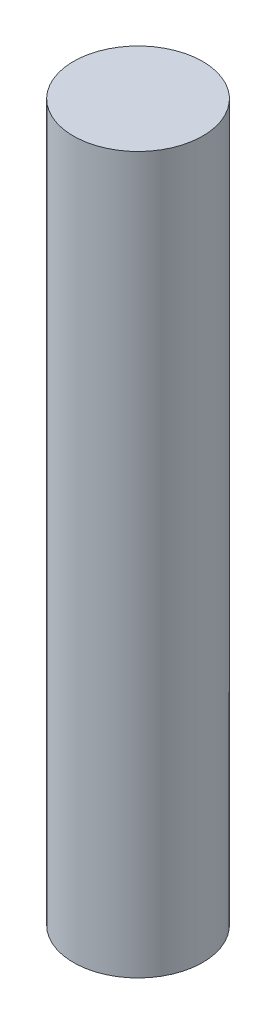
ISO-10303-21;
HEADER;
FILE_DESCRIPTION(('STEP AP214'),'2;1');
FILE_NAME('part.step','',(''),(''),'','','');
FILE_SCHEMA(('AUTOMOTIVE_DESIGN { 1 0 10303 214 1 1 1 1 }'));
ENDSEC;
DATA;
#1=APPLICATION_CONTEXT('core data for automotive mechanical design processes');
#2=APPLICATION_PROTOCOL_DEFINITION('international standard','automotive_design',2000,#1);
#3=PRODUCT_CONTEXT('',#1,'mechanical');
#4=PRODUCT('Part','Part','',(#3));
#5=PRODUCT_RELATED_PRODUCT_CATEGORY('part','',(#4));
#6=PRODUCT_DEFINITION_FORMATION('','',#4);
#7=PRODUCT_DEFINITION_CONTEXT('part definition',#1,'design');
#8=PRODUCT_DEFINITION('design','',#6,#7);
#9=PRODUCT_DEFINITION_SHAPE('','',#8);
#10=(LENGTH_UNIT() NAMED_UNIT(*) SI_UNIT(.MILLI.,.METRE.));
#11=(NAMED_UNIT(*) PLANE_ANGLE_UNIT() SI_UNIT($,.RADIAN.));
#12=(NAMED_UNIT(*) SI_UNIT($,.STERADIAN.) SOLID_ANGLE_UNIT());
#13=UNCERTAINTY_MEASURE_WITH_UNIT(LENGTH_MEASURE(1.E-05),#10,'distance_accuracy_value','');
#14=(GEOMETRIC_REPRESENTATION_CONTEXT(3) GLOBAL_UNCERTAINTY_ASSIGNED_CONTEXT((#13)) GLOBAL_UNIT_ASSIGNED_CONTEXT((#10,
#11,#12)) REPRESENTATION_CONTEXT('',''));
#15=CARTESIAN_POINT('',(0.,0.,0.));
#16=DIRECTION('',(0.,0.,1.));
#17=DIRECTION('',(1.,0.,0.));
#18=AXIS2_PLACEMENT_3D('',#15,#16,#17);
#19=CARTESIAN_POINT('',(0.,15.5,0.));
#20=DIRECTION('',(0.,-1.,0.));
#21=DIRECTION('',(0.,0.,1.));
#22=AXIS2_PLACEMENT_3D('',#19,#20,#21);
#23=CYLINDRICAL_SURFACE('',#22,1.4);
#24=CARTESIAN_POINT('',(0.,15.5,0.));
#25=DIRECTION('',(0.,-1.,0.));
#26=DIRECTION('',(0.,0.,-1.));
#27=AXIS2_PLACEMENT_3D('',#24,#25,#26);
#28=CIRCLE('',#27,1.4);
#29=CARTESIAN_POINT('',(0.,15.5,-1.4));
#30=VERTEX_POINT('',#29);
#31=EDGE_CURVE('E10',#30,#30,#28,.T.);
#32=ORIENTED_EDGE('',*,*,#31,.T.);
#33=EDGE_LOOP('',(#32));
#34=FACE_BOUND('',#33,.T.);
#35=CARTESIAN_POINT('',(0.,0.,0.));
#36=DIRECTION('',(0.,-1.,0.));
#37=DIRECTION('',(0.,0.,-1.));
#38=AXIS2_PLACEMENT_3D('',#35,#36,#37);
#39=CIRCLE('',#38,1.4);
#40=CARTESIAN_POINT('',(0.,0.,-1.4));
#41=VERTEX_POINT('',#40);
#42=EDGE_CURVE('E38',#41,#41,#39,.T.);
#43=ORIENTED_EDGE('',*,*,#42,.F.);
#44=EDGE_LOOP('',(#43));
#45=FACE_BOUND('',#44,.T.);
#46=ADVANCED_FACE('F35',(#34,#45),#23,.T.);
#47=CARTESIAN_POINT('',(0.,15.5,0.));
#48=DIRECTION('',(0.,1.,0.));
#49=DIRECTION('',(0.,0.,-1.));
#50=AXIS2_PLACEMENT_3D('',#47,#48,#49);
#51=PLANE('',#50);
#52=ORIENTED_EDGE('',*,*,#31,.F.);
#53=EDGE_LOOP('',(#52));
#54=FACE_BOUND('',#53,.T.);
#55=ADVANCED_FACE('F50',(#54),#51,.T.);
#56=CARTESIAN_POINT('',(0.,0.,0.));
#57=DIRECTION('',(0.,1.,0.));
#58=DIRECTION('',(0.,0.,-1.));
#59=AXIS2_PLACEMENT_3D('',#56,#57,#58);
#60=PLANE('',#59);
#61=ORIENTED_EDGE('',*,*,#42,.T.);
#62=EDGE_LOOP('',(#61));
#63=FACE_BOUND('',#62,.T.);
#64=ADVANCED_FACE('F47',(#63),#60,.F.);
#65=CLOSED_SHELL('',(#46,#55,#64));
#66=MANIFOLD_SOLID_BREP('B2',#65);
#67=ADVANCED_BREP_SHAPE_REPRESENTATION('',(#18,#66),#14);
#68=SHAPE_DEFINITION_REPRESENTATION(#9,#67);
ENDSEC;
END-ISO-10303-21;
